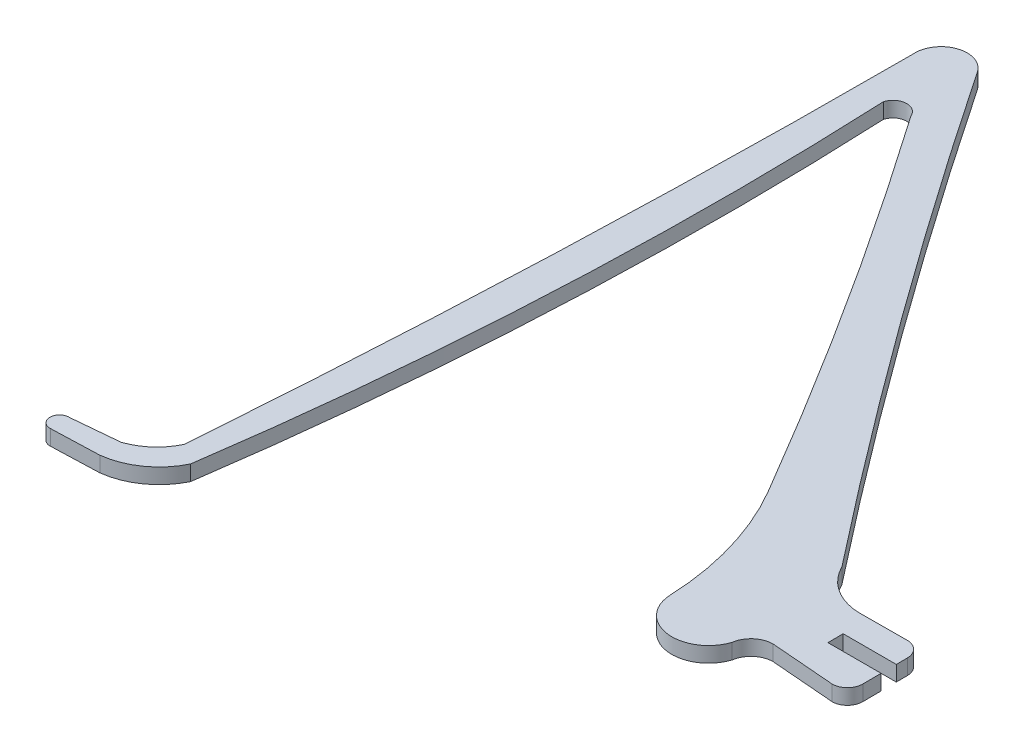
ISO-10303-21;
HEADER;
FILE_DESCRIPTION(('STEP AP214'),'2;1');
FILE_NAME('part.step','',(''),(''),'','','');
FILE_SCHEMA(('AUTOMOTIVE_DESIGN { 1 0 10303 214 1 1 1 1 }'));
ENDSEC;
DATA;
#1=APPLICATION_CONTEXT('core data for automotive mechanical design processes');
#2=APPLICATION_PROTOCOL_DEFINITION('international standard','automotive_design',2000,#1);
#3=PRODUCT_CONTEXT('',#1,'mechanical');
#4=PRODUCT('Part','Part','',(#3));
#5=PRODUCT_RELATED_PRODUCT_CATEGORY('part','',(#4));
#6=PRODUCT_DEFINITION_FORMATION('','',#4);
#7=PRODUCT_DEFINITION_CONTEXT('part definition',#1,'design');
#8=PRODUCT_DEFINITION('design','',#6,#7);
#9=PRODUCT_DEFINITION_SHAPE('','',#8);
#10=(LENGTH_UNIT() NAMED_UNIT(*) SI_UNIT(.MILLI.,.METRE.));
#11=(NAMED_UNIT(*) PLANE_ANGLE_UNIT() SI_UNIT($,.RADIAN.));
#12=(NAMED_UNIT(*) SI_UNIT($,.STERADIAN.) SOLID_ANGLE_UNIT());
#13=UNCERTAINTY_MEASURE_WITH_UNIT(LENGTH_MEASURE(1.E-05),#10,'distance_accuracy_value','');
#14=(GEOMETRIC_REPRESENTATION_CONTEXT(3) GLOBAL_UNCERTAINTY_ASSIGNED_CONTEXT((#13)) GLOBAL_UNIT_ASSIGNED_CONTEXT((#10,
#11,#12)) REPRESENTATION_CONTEXT('',''));
#15=CARTESIAN_POINT('',(0.,0.,0.));
#16=DIRECTION('',(0.,0.,1.));
#17=DIRECTION('',(1.,0.,0.));
#18=AXIS2_PLACEMENT_3D('',#15,#16,#17);
#19=CARTESIAN_POINT('',(-42152.2019871331,3.,-18324.132786319));
#20=DIRECTION('',(0.,-1.,0.));
#21=DIRECTION('',(0.,0.,-1.));
#22=AXIS2_PLACEMENT_3D('',#19,#20,#21);
#23=CYLINDRICAL_SURFACE('',#22,13.2933695187014);
#24=CARTESIAN_POINT('',(-42152.2019871331,0.,-18324.132786319));
#25=DIRECTION('',(0.,1.,0.));
#26=DIRECTION('',(0.,0.,1.));
#27=AXIS2_PLACEMENT_3D('',#24,#25,#26);
#28=CIRCLE('',#27,13.2933695187014);
#29=CARTESIAN_POINT('',(-42150.574219,0.,-18310.939453));
#30=VERTEX_POINT('',#29);
#31=CARTESIAN_POINT('',(-42140.243633,0.,-18318.326631));
#32=VERTEX_POINT('',#31);
#33=EDGE_CURVE('E227',#30,#32,#28,.T.);
#34=ORIENTED_EDGE('',*,*,#33,.T.);
#35=DIRECTION('',(0.,-1.,0.));
#36=VECTOR('',#35,1.);
#37=CARTESIAN_POINT('',(-42140.243633,3.,-18318.326631));
#38=LINE('',#37,#36);
#39=CARTESIAN_POINT('',(-42140.243633,3.,-18318.326631));
#40=VERTEX_POINT('',#39);
#41=EDGE_CURVE('E11',#40,#32,#38,.T.);
#42=ORIENTED_EDGE('',*,*,#41,.F.);
#43=CARTESIAN_POINT('',(-42152.2019871331,3.,-18324.132786319));
#44=DIRECTION('',(0.,1.,0.));
#45=DIRECTION('',(0.,0.,1.));
#46=AXIS2_PLACEMENT_3D('',#43,#44,#45);
#47=CIRCLE('',#46,13.2933695187014);
#48=CARTESIAN_POINT('',(-42150.574219,3.,-18310.939453));
#49=VERTEX_POINT('',#48);
#50=EDGE_CURVE('E273',#49,#40,#47,.T.);
#51=ORIENTED_EDGE('',*,*,#50,.F.);
#52=DIRECTION('',(0.,-1.,0.));
#53=VECTOR('',#52,1.);
#54=CARTESIAN_POINT('',(-42150.574219,3.,-18310.939453));
#55=LINE('',#54,#53);
#56=EDGE_CURVE('E223',#49,#30,#55,.T.);
#57=ORIENTED_EDGE('',*,*,#56,.T.);
#58=EDGE_LOOP('',(#34,#42,#51,#57));
#59=FACE_BOUND('',#58,.T.);
#60=ADVANCED_FACE('F35',(#59),#23,.T.);
#61=CARTESIAN_POINT('',(-42815.5416982019,3.,-18416.5647065553));
#62=DIRECTION('',(0.,-1.,0.));
#63=DIRECTION('',(0.,0.,-1.));
#64=AXIS2_PLACEMENT_3D('',#61,#62,#63);
#65=CYLINDRICAL_SURFACE('',#64,682.406181357024);
#66=CARTESIAN_POINT('',(-42815.5416982019,0.,-18416.5647065553));
#67=DIRECTION('',(0.,1.,0.));
#68=DIRECTION('',(0.,0.,1.));
#69=AXIS2_PLACEMENT_3D('',#66,#67,#68);
#70=CIRCLE('',#69,682.406181357024);
#71=CARTESIAN_POINT('',(-42133.839682,0.,-18447.557568));
#72=VERTEX_POINT('',#71);
#73=EDGE_CURVE('E230',#32,#72,#70,.T.);
#74=ORIENTED_EDGE('',*,*,#73,.T.);
#75=DIRECTION('',(0.,-1.,0.));
#76=VECTOR('',#75,1.);
#77=CARTESIAN_POINT('',(-42133.839682,3.,-18447.557568));
#78=LINE('',#77,#76);
#79=CARTESIAN_POINT('',(-42133.839682,3.,-18447.557568));
#80=VERTEX_POINT('',#79);
#81=EDGE_CURVE('E43',#80,#72,#78,.T.);
#82=ORIENTED_EDGE('',*,*,#81,.F.);
#83=CARTESIAN_POINT('',(-42815.5416982019,3.,-18416.5647065553));
#84=DIRECTION('',(0.,1.,0.));
#85=DIRECTION('',(0.,0.,1.));
#86=AXIS2_PLACEMENT_3D('',#83,#84,#85);
#87=CIRCLE('',#86,682.406181357024);
#88=EDGE_CURVE('E142',#40,#80,#87,.T.);
#89=ORIENTED_EDGE('',*,*,#88,.F.);
#90=ORIENTED_EDGE('',*,*,#41,.T.);
#91=EDGE_LOOP('',(#74,#82,#89,#90));
#92=FACE_BOUND('',#91,.T.);
#93=ADVANCED_FACE('F411',(#92),#65,.T.);
#94=CARTESIAN_POINT('',(-42131.2401209528,3.,-18446.8614757578));
#95=DIRECTION('',(0.,-1.,0.));
#96=DIRECTION('',(0.,0.,-1.));
#97=AXIS2_PLACEMENT_3D('',#94,#95,#96);
#98=CYLINDRICAL_SURFACE('',#97,2.69114511830755);
#99=CARTESIAN_POINT('',(-42131.2401209528,0.,-18446.8614757578));
#100=DIRECTION('',(0.,-1.,0.));
#101=DIRECTION('',(0.,0.,1.));
#102=AXIS2_PLACEMENT_3D('',#99,#100,#101);
#103=CIRCLE('',#102,2.69114511830755);
#104=CARTESIAN_POINT('',(-42128.7660750005,0.,-18447.9204180008));
#105=VERTEX_POINT('',#104);
#106=EDGE_CURVE('E232',#72,#105,#103,.T.);
#107=ORIENTED_EDGE('',*,*,#106,.T.);
#108=DIRECTION('',(0.,-1.,0.));
#109=VECTOR('',#108,1.);
#110=CARTESIAN_POINT('',(-42128.7660750005,3.,-18447.9204180008));
#111=LINE('',#110,#109);
#112=CARTESIAN_POINT('',(-42128.7660750005,3.,-18447.9204180008));
#113=VERTEX_POINT('',#112);
#114=EDGE_CURVE('E328',#113,#105,#111,.T.);
#115=ORIENTED_EDGE('',*,*,#114,.F.);
#116=CARTESIAN_POINT('',(-42131.2401209528,3.,-18446.8614757578));
#117=DIRECTION('',(0.,-1.,0.));
#118=DIRECTION('',(0.,0.,1.));
#119=AXIS2_PLACEMENT_3D('',#116,#117,#118);
#120=CIRCLE('',#119,2.69114511830755);
#121=EDGE_CURVE('E336',#80,#113,#120,.T.);
#122=ORIENTED_EDGE('',*,*,#121,.F.);
#123=ORIENTED_EDGE('',*,*,#81,.T.);
#124=EDGE_LOOP('',(#107,#115,#122,#123));
#125=FACE_BOUND('',#124,.T.);
#126=ADVANCED_FACE('F334',(#125),#98,.F.);
#127=CARTESIAN_POINT('',(-43061.4448435393,3.,-17796.1186435821));
#128=DIRECTION('',(0.,-1.,0.));
#129=DIRECTION('',(0.,0.,-1.));
#130=AXIS2_PLACEMENT_3D('',#127,#128,#129);
#131=CYLINDRICAL_SURFACE('',#130,1137.8643321672);
#132=CARTESIAN_POINT('',(-43061.4448435393,0.,-17796.1186435821));
#133=DIRECTION('',(0.,-1.,0.));
#134=DIRECTION('',(0.,0.,1.));
#135=AXIS2_PLACEMENT_3D('',#132,#133,#134);
#136=CIRCLE('',#135,1137.8643321672);
#137=CARTESIAN_POINT('',(-42079.0087570001,0.,-18370.187084));
#138=VERTEX_POINT('',#137);
#139=EDGE_CURVE('E234',#105,#138,#136,.T.);
#140=ORIENTED_EDGE('',*,*,#139,.T.);
#141=DIRECTION('',(0.,-1.,0.));
#142=VECTOR('',#141,1.);
#143=CARTESIAN_POINT('',(-42079.0087570001,3.,-18370.187084));
#144=LINE('',#143,#142);
#145=CARTESIAN_POINT('',(-42079.0087570001,3.,-18370.187084));
#146=VERTEX_POINT('',#145);
#147=EDGE_CURVE('E325',#146,#138,#144,.T.);
#148=ORIENTED_EDGE('',*,*,#147,.F.);
#149=CARTESIAN_POINT('',(-43061.4448435393,3.,-17796.1186435821));
#150=DIRECTION('',(0.,-1.,0.));
#151=DIRECTION('',(0.,0.,1.));
#152=AXIS2_PLACEMENT_3D('',#149,#150,#151);
#153=CIRCLE('',#152,1137.8643321672);
#154=EDGE_CURVE('E354',#113,#146,#153,.T.);
#155=ORIENTED_EDGE('',*,*,#154,.F.);
#156=ORIENTED_EDGE('',*,*,#114,.T.);
#157=EDGE_LOOP('',(#140,#148,#155,#156));
#158=FACE_BOUND('',#157,.T.);
#159=ADVANCED_FACE('F345',(#158),#131,.F.);
#160=CARTESIAN_POINT('',(-42129.6551655374,3.,-18340.5861490765));
#161=DIRECTION('',(0.,-1.,0.));
#162=DIRECTION('',(0.,0.,-1.));
#163=AXIS2_PLACEMENT_3D('',#160,#161,#162);
#164=CYLINDRICAL_SURFACE('',#163,58.6623733417004);
#165=CARTESIAN_POINT('',(-42129.6551655374,0.,-18340.5861490765));
#166=DIRECTION('',(0.,-1.,0.));
#167=DIRECTION('',(0.,0.,1.));
#168=AXIS2_PLACEMENT_3D('',#165,#166,#167);
#169=CIRCLE('',#168,58.6623733417004);
#170=CARTESIAN_POINT('',(-42071.044649,0.,-18343.052198));
#171=VERTEX_POINT('',#170);
#172=EDGE_CURVE('E236',#138,#171,#169,.T.);
#173=ORIENTED_EDGE('',*,*,#172,.T.);
#174=DIRECTION('',(0.,-1.,0.));
#175=VECTOR('',#174,1.);
#176=CARTESIAN_POINT('',(-42071.044649,3.,-18343.052198));
#177=LINE('',#176,#175);
#178=CARTESIAN_POINT('',(-42071.044649,3.,-18343.052198));
#179=VERTEX_POINT('',#178);
#180=EDGE_CURVE('E322',#179,#171,#177,.T.);
#181=ORIENTED_EDGE('',*,*,#180,.F.);
#182=CARTESIAN_POINT('',(-42129.6551655374,3.,-18340.5861490765));
#183=DIRECTION('',(0.,-1.,0.));
#184=DIRECTION('',(0.,0.,1.));
#185=AXIS2_PLACEMENT_3D('',#182,#183,#184);
#186=CIRCLE('',#185,58.6623733417004);
#187=EDGE_CURVE('E351',#146,#179,#186,.T.);
#188=ORIENTED_EDGE('',*,*,#187,.F.);
#189=ORIENTED_EDGE('',*,*,#147,.T.);
#190=EDGE_LOOP('',(#173,#181,#188,#189));
#191=FACE_BOUND('',#190,.T.);
#192=ADVANCED_FACE('F349',(#191),#164,.F.);
#193=CARTESIAN_POINT('',(-42063.8327879743,3.,-18343.3555760008));
#194=DIRECTION('',(0.,-1.,0.));
#195=DIRECTION('',(0.,0.,-1.));
#196=AXIS2_PLACEMENT_3D('',#193,#194,#195);
#197=CYLINDRICAL_SURFACE('',#196,7.21823923584698);
#198=CARTESIAN_POINT('',(-42063.8327879743,0.,-18343.3555760008));
#199=DIRECTION('',(0.,1.,0.));
#200=DIRECTION('',(0.,0.,1.));
#201=AXIS2_PLACEMENT_3D('',#198,#199,#200);
#202=CIRCLE('',#201,7.21823923584698);
#203=CARTESIAN_POINT('',(-42056.987565,0.,-18341.0651829999));
#204=VERTEX_POINT('',#203);
#205=EDGE_CURVE('E238',#171,#204,#202,.T.);
#206=ORIENTED_EDGE('',*,*,#205,.T.);
#207=DIRECTION('',(0.,-1.,0.));
#208=VECTOR('',#207,1.);
#209=CARTESIAN_POINT('',(-42056.987565,3.,-18341.0651829999));
#210=LINE('',#209,#208);
#211=CARTESIAN_POINT('',(-42056.987565,3.,-18341.0651829999));
#212=VERTEX_POINT('',#211);
#213=EDGE_CURVE('E319',#212,#204,#210,.T.);
#214=ORIENTED_EDGE('',*,*,#213,.F.);
#215=CARTESIAN_POINT('',(-42063.8327879743,3.,-18343.3555760008));
#216=DIRECTION('',(0.,1.,0.));
#217=DIRECTION('',(0.,0.,1.));
#218=AXIS2_PLACEMENT_3D('',#215,#216,#217);
#219=CIRCLE('',#218,7.21823923584698);
#220=EDGE_CURVE('E353',#179,#212,#219,.T.);
#221=ORIENTED_EDGE('',*,*,#220,.F.);
#222=ORIENTED_EDGE('',*,*,#180,.T.);
#223=EDGE_LOOP('',(#206,#214,#221,#222));
#224=FACE_BOUND('',#223,.T.);
#225=ADVANCED_FACE('F424',(#224),#197,.T.);
#226=CARTESIAN_POINT('',(-42052.671817147,3.,-18340.478566385));
#227=DIRECTION('',(0.,-1.,0.));
#228=DIRECTION('',(0.,0.,-1.));
#229=AXIS2_PLACEMENT_3D('',#226,#227,#228);
#230=CYLINDRICAL_SURFACE('',#229,4.35543322569655);
#231=CARTESIAN_POINT('',(-42052.671817147,0.,-18340.478566385));
#232=DIRECTION('',(0.,-1.,0.));
#233=DIRECTION('',(0.,0.,1.));
#234=AXIS2_PLACEMENT_3D('',#231,#232,#233);
#235=CIRCLE('',#234,4.35543322569655);
#236=CARTESIAN_POINT('',(-42052.660156,0.,-18344.833984));
#237=VERTEX_POINT('',#236);
#238=EDGE_CURVE('E240',#204,#237,#235,.T.);
#239=ORIENTED_EDGE('',*,*,#238,.T.);
#240=DIRECTION('',(0.,-1.,0.));
#241=VECTOR('',#240,1.);
#242=CARTESIAN_POINT('',(-42052.660156,3.,-18344.833984));
#243=LINE('',#242,#241);
#244=CARTESIAN_POINT('',(-42052.660156,3.,-18344.833984));
#245=VERTEX_POINT('',#244);
#246=EDGE_CURVE('E316',#245,#237,#243,.T.);
#247=ORIENTED_EDGE('',*,*,#246,.F.);
#248=CARTESIAN_POINT('',(-42052.671817147,3.,-18340.478566385));
#249=DIRECTION('',(0.,-1.,0.));
#250=DIRECTION('',(0.,0.,1.));
#251=AXIS2_PLACEMENT_3D('',#248,#249,#250);
#252=CIRCLE('',#251,4.35543322569655);
#253=EDGE_CURVE('E356',#212,#245,#252,.T.);
#254=ORIENTED_EDGE('',*,*,#253,.F.);
#255=ORIENTED_EDGE('',*,*,#213,.T.);
#256=EDGE_LOOP('',(#239,#247,#254,#255));
#257=FACE_BOUND('',#256,.T.);
#258=ADVANCED_FACE('F427',(#257),#230,.F.);
#259=CARTESIAN_POINT('',(-42040.093369,3.,-18343.8164720001));
#260=DIRECTION('',(0.0807042381147705,0.,-0.996738092956376));
#261=DIRECTION('',(-0.996738092956377,0.,-0.0807042381147705));
#262=AXIS2_PLACEMENT_3D('',#259,#260,#261);
#263=PLANE('',#262);
#264=DIRECTION('',(0.996738092956377,0.,0.0807042381147705));
#265=VECTOR('',#264,1.);
#266=CARTESIAN_POINT('',(-42040.093369,0.,-18343.8164720001));
#267=LINE('',#266,#265);
#268=CARTESIAN_POINT('',(-42040.093369,0.,-18343.8164720001));
#269=VERTEX_POINT('',#268);
#270=EDGE_CURVE('E242',#237,#269,#267,.T.);
#271=ORIENTED_EDGE('',*,*,#270,.T.);
#272=DIRECTION('',(0.,-1.,0.));
#273=VECTOR('',#272,1.);
#274=CARTESIAN_POINT('',(-42040.093369,3.,-18343.8164720001));
#275=LINE('',#274,#273);
#276=CARTESIAN_POINT('',(-42040.093369,3.,-18343.8164720001));
#277=VERTEX_POINT('',#276);
#278=EDGE_CURVE('E313',#277,#269,#275,.T.);
#279=ORIENTED_EDGE('',*,*,#278,.F.);
#280=DIRECTION('',(0.996738092956377,0.,0.0807042381147705));
#281=VECTOR('',#280,1.);
#282=CARTESIAN_POINT('',(-42040.093369,3.,-18343.8164720001));
#283=LINE('',#282,#281);
#284=EDGE_CURVE('E362',#245,#277,#283,.T.);
#285=ORIENTED_EDGE('',*,*,#284,.F.);
#286=ORIENTED_EDGE('',*,*,#246,.T.);
#287=EDGE_LOOP('',(#271,#279,#285,#286));
#288=FACE_BOUND('',#287,.T.);
#289=ADVANCED_FACE('F431',(#288),#263,.F.);
#290=CARTESIAN_POINT('',(-42040.1151884056,3.,-18346.8144708554));
#291=DIRECTION('',(0.,-1.,0.));
#292=DIRECTION('',(0.,0.,-1.));
#293=AXIS2_PLACEMENT_3D('',#290,#291,#292);
#294=CYLINDRICAL_SURFACE('',#293,2.99807825499825);
#295=CARTESIAN_POINT('',(-42040.1151884056,0.,-18346.8144708554));
#296=DIRECTION('',(0.,1.,0.));
#297=DIRECTION('',(0.,0.,1.));
#298=AXIS2_PLACEMENT_3D('',#295,#296,#297);
#299=CIRCLE('',#298,2.99807825499825);
#300=CARTESIAN_POINT('',(-42037.117187,0.,-18346.835937));
#301=VERTEX_POINT('',#300);
#302=EDGE_CURVE('E244',#269,#301,#299,.T.);
#303=ORIENTED_EDGE('',*,*,#302,.T.);
#304=DIRECTION('',(0.,-1.,0.));
#305=VECTOR('',#304,1.);
#306=CARTESIAN_POINT('',(-42037.117187,3.,-18346.835937));
#307=LINE('',#306,#305);
#308=CARTESIAN_POINT('',(-42037.117187,3.,-18346.835937));
#309=VERTEX_POINT('',#308);
#310=EDGE_CURVE('E310',#309,#301,#307,.T.);
#311=ORIENTED_EDGE('',*,*,#310,.F.);
#312=CARTESIAN_POINT('',(-42040.1151884056,3.,-18346.8144708554));
#313=DIRECTION('',(0.,1.,0.));
#314=DIRECTION('',(0.,0.,1.));
#315=AXIS2_PLACEMENT_3D('',#312,#313,#314);
#316=CIRCLE('',#315,2.99807825499825);
#317=EDGE_CURVE('E364',#277,#309,#316,.T.);
#318=ORIENTED_EDGE('',*,*,#317,.F.);
#319=ORIENTED_EDGE('',*,*,#278,.T.);
#320=EDGE_LOOP('',(#303,#311,#318,#319));
#321=FACE_BOUND('',#320,.T.);
#322=ADVANCED_FACE('F435',(#321),#294,.T.);
#323=CARTESIAN_POINT('',(-42037.140625,3.,-18350.431641));
#324=DIRECTION('',(-0.999978756337311,0.,0.00651819561568033));
#325=DIRECTION('',(0.00651819561568033,0.,0.999978756337311));
#326=AXIS2_PLACEMENT_3D('',#323,#324,#325);
#327=PLANE('',#326);
#328=DIRECTION('',(-0.00651819561568033,0.,-0.999978756337311));
#329=VECTOR('',#328,1.);
#330=CARTESIAN_POINT('',(-42037.140625,0.,-18350.431641));
#331=LINE('',#330,#329);
#332=CARTESIAN_POINT('',(-42037.140625,0.,-18350.431641));
#333=VERTEX_POINT('',#332);
#334=EDGE_CURVE('E246',#301,#333,#331,.T.);
#335=ORIENTED_EDGE('',*,*,#334,.T.);
#336=DIRECTION('',(0.,-1.,0.));
#337=VECTOR('',#336,1.);
#338=CARTESIAN_POINT('',(-42037.140625,3.,-18350.431641));
#339=LINE('',#338,#337);
#340=CARTESIAN_POINT('',(-42037.140625,3.,-18350.431641));
#341=VERTEX_POINT('',#340);
#342=EDGE_CURVE('E307',#341,#333,#339,.T.);
#343=ORIENTED_EDGE('',*,*,#342,.F.);
#344=DIRECTION('',(-0.00651819561568033,0.,-0.999978756337311));
#345=VECTOR('',#344,1.);
#346=CARTESIAN_POINT('',(-42037.140625,3.,-18350.431641));
#347=LINE('',#346,#345);
#348=EDGE_CURVE('E366',#309,#341,#347,.T.);
#349=ORIENTED_EDGE('',*,*,#348,.F.);
#350=ORIENTED_EDGE('',*,*,#310,.T.);
#351=EDGE_LOOP('',(#335,#343,#349,#350));
#352=FACE_BOUND('',#351,.T.);
#353=ADVANCED_FACE('F439',(#352),#327,.F.);
#354=CARTESIAN_POINT('',(-42047.542969,3.,-18350.429687));
#355=DIRECTION('',(0.000187842275142555,0.,0.99999998235764));
#356=DIRECTION('',(0.99999998235764,0.,-0.000187842275142555));
#357=AXIS2_PLACEMENT_3D('',#354,#355,#356);
#358=PLANE('',#357);
#359=DIRECTION('',(-0.99999998235764,0.,0.000187842275142555));
#360=VECTOR('',#359,1.);
#361=CARTESIAN_POINT('',(-42047.542969,0.,-18350.429687));
#362=LINE('',#361,#360);
#363=CARTESIAN_POINT('',(-42047.542969,0.,-18350.429687));
#364=VERTEX_POINT('',#363);
#365=EDGE_CURVE('E248',#333,#364,#362,.T.);
#366=ORIENTED_EDGE('',*,*,#365,.T.);
#367=DIRECTION('',(0.,-1.,0.));
#368=VECTOR('',#367,1.);
#369=CARTESIAN_POINT('',(-42047.542969,3.,-18350.429687));
#370=LINE('',#369,#368);
#371=CARTESIAN_POINT('',(-42047.542969,3.,-18350.429687));
#372=VERTEX_POINT('',#371);
#373=EDGE_CURVE('E304',#372,#364,#370,.T.);
#374=ORIENTED_EDGE('',*,*,#373,.F.);
#375=DIRECTION('',(-0.99999998235764,0.,0.000187842275142555));
#376=VECTOR('',#375,1.);
#377=CARTESIAN_POINT('',(-42047.542969,3.,-18350.429687));
#378=LINE('',#377,#376);
#379=EDGE_CURVE('E368',#341,#372,#378,.T.);
#380=ORIENTED_EDGE('',*,*,#379,.F.);
#381=ORIENTED_EDGE('',*,*,#342,.T.);
#382=EDGE_LOOP('',(#366,#374,#380,#381));
#383=FACE_BOUND('',#382,.T.);
#384=ADVANCED_FACE('F443',(#383),#358,.F.);
#385=CARTESIAN_POINT('',(-42047.566406,3.,-18353.429687));
#386=DIRECTION('',(-0.999969485120749,0.,0.00781209493955122));
#387=DIRECTION('',(0.00781209493955122,0.,0.999969485120749));
#388=AXIS2_PLACEMENT_3D('',#385,#386,#387);
#389=PLANE('',#388);
#390=DIRECTION('',(-0.00781209493955123,0.,-0.999969485120749));
#391=VECTOR('',#390,1.);
#392=CARTESIAN_POINT('',(-42047.566406,0.,-18353.429687));
#393=LINE('',#392,#391);
#394=CARTESIAN_POINT('',(-42047.566406,0.,-18353.429687));
#395=VERTEX_POINT('',#394);
#396=EDGE_CURVE('E250',#364,#395,#393,.T.);
#397=ORIENTED_EDGE('',*,*,#396,.T.);
#398=DIRECTION('',(0.,-1.,0.));
#399=VECTOR('',#398,1.);
#400=CARTESIAN_POINT('',(-42047.566406,3.,-18353.429687));
#401=LINE('',#400,#399);
#402=CARTESIAN_POINT('',(-42047.566406,3.,-18353.429687));
#403=VERTEX_POINT('',#402);
#404=EDGE_CURVE('E301',#403,#395,#401,.T.);
#405=ORIENTED_EDGE('',*,*,#404,.F.);
#406=DIRECTION('',(-0.00781209493955123,0.,-0.999969485120749));
#407=VECTOR('',#406,1.);
#408=CARTESIAN_POINT('',(-42047.566406,3.,-18353.429687));
#409=LINE('',#408,#407);
#410=EDGE_CURVE('E370',#372,#403,#409,.T.);
#411=ORIENTED_EDGE('',*,*,#410,.F.);
#412=ORIENTED_EDGE('',*,*,#373,.T.);
#413=EDGE_LOOP('',(#397,#405,#411,#412));
#414=FACE_BOUND('',#413,.T.);
#415=ADVANCED_FACE('F447',(#414),#389,.F.);
#416=CARTESIAN_POINT('',(-42037.160156,3.,-18353.429687));
#417=DIRECTION('',(0.,0.,-1.));
#418=DIRECTION('',(-1.,0.,0.));
#419=AXIS2_PLACEMENT_3D('',#416,#417,#418);
#420=PLANE('',#419);
#421=DIRECTION('',(1.,0.,0.));
#422=VECTOR('',#421,1.);
#423=CARTESIAN_POINT('',(-42037.160156,0.,-18353.429687));
#424=LINE('',#423,#422);
#425=CARTESIAN_POINT('',(-42037.160156,0.,-18353.429687));
#426=VERTEX_POINT('',#425);
#427=EDGE_CURVE('E252',#395,#426,#424,.T.);
#428=ORIENTED_EDGE('',*,*,#427,.T.);
#429=DIRECTION('',(0.,-1.,0.));
#430=VECTOR('',#429,1.);
#431=CARTESIAN_POINT('',(-42037.160156,3.,-18353.429687));
#432=LINE('',#431,#430);
#433=CARTESIAN_POINT('',(-42037.160156,3.,-18353.429687));
#434=VERTEX_POINT('',#433);
#435=EDGE_CURVE('E298',#434,#426,#432,.T.);
#436=ORIENTED_EDGE('',*,*,#435,.F.);
#437=DIRECTION('',(1.,0.,0.));
#438=VECTOR('',#437,1.);
#439=CARTESIAN_POINT('',(-42037.160156,3.,-18353.429687));
#440=LINE('',#439,#438);
#441=EDGE_CURVE('E372',#403,#434,#440,.T.);
#442=ORIENTED_EDGE('',*,*,#441,.F.);
#443=ORIENTED_EDGE('',*,*,#404,.T.);
#444=EDGE_LOOP('',(#428,#436,#442,#443));
#445=FACE_BOUND('',#444,.T.);
#446=ADVANCED_FACE('F451',(#445),#420,.F.);
#447=CARTESIAN_POINT('',(-42037.171934,3.,-18355.612608));
#448=DIRECTION('',(-0.999985444484614,0.,0.00539544427346079));
#449=DIRECTION('',(0.00539544427346079,0.,0.999985444484615));
#450=AXIS2_PLACEMENT_3D('',#447,#448,#449);
#451=PLANE('',#450);
#452=DIRECTION('',(-0.00539544427346079,0.,-0.999985444484615));
#453=VECTOR('',#452,1.);
#454=CARTESIAN_POINT('',(-42037.171934,0.,-18355.612608));
#455=LINE('',#454,#453);
#456=CARTESIAN_POINT('',(-42037.171934,0.,-18355.612608));
#457=VERTEX_POINT('',#456);
#458=EDGE_CURVE('E254',#426,#457,#455,.T.);
#459=ORIENTED_EDGE('',*,*,#458,.T.);
#460=DIRECTION('',(0.,-1.,0.));
#461=VECTOR('',#460,1.);
#462=CARTESIAN_POINT('',(-42037.171934,3.,-18355.612608));
#463=LINE('',#462,#461);
#464=CARTESIAN_POINT('',(-42037.171934,3.,-18355.612608));
#465=VERTEX_POINT('',#464);
#466=EDGE_CURVE('E295',#465,#457,#463,.T.);
#467=ORIENTED_EDGE('',*,*,#466,.F.);
#468=DIRECTION('',(-0.00539544427346079,0.,-0.999985444484615));
#469=VECTOR('',#468,1.);
#470=CARTESIAN_POINT('',(-42037.171934,3.,-18355.612608));
#471=LINE('',#470,#469);
#472=EDGE_CURVE('E374',#434,#465,#471,.T.);
#473=ORIENTED_EDGE('',*,*,#472,.F.);
#474=ORIENTED_EDGE('',*,*,#435,.T.);
#475=EDGE_LOOP('',(#459,#467,#473,#474));
#476=FACE_BOUND('',#475,.T.);
#477=ADVANCED_FACE('F455',(#476),#451,.F.);
#478=CARTESIAN_POINT('',(-42040.1738707403,3.,-18355.5957229876));
#479=DIRECTION('',(0.,-1.,0.));
#480=DIRECTION('',(0.,0.,-1.));
#481=AXIS2_PLACEMENT_3D('',#478,#479,#480);
#482=CYLINDRICAL_SURFACE('',#481,3.00198422650736);
#483=CARTESIAN_POINT('',(-42040.1738707403,0.,-18355.5957229876));
#484=DIRECTION('',(0.,1.,0.));
#485=DIRECTION('',(0.,0.,1.));
#486=AXIS2_PLACEMENT_3D('',#483,#484,#485);
#487=CIRCLE('',#486,3.00198422650736);
#488=CARTESIAN_POINT('',(-42040.191406,0.,-18358.597656));
#489=VERTEX_POINT('',#488);
#490=EDGE_CURVE('E256',#457,#489,#487,.T.);
#491=ORIENTED_EDGE('',*,*,#490,.T.);
#492=DIRECTION('',(0.,-1.,0.));
#493=VECTOR('',#492,1.);
#494=CARTESIAN_POINT('',(-42040.191406,3.,-18358.597656));
#495=LINE('',#494,#493);
#496=CARTESIAN_POINT('',(-42040.191406,3.,-18358.597656));
#497=VERTEX_POINT('',#496);
#498=EDGE_CURVE('E292',#497,#489,#495,.T.);
#499=ORIENTED_EDGE('',*,*,#498,.F.);
#500=CARTESIAN_POINT('',(-42040.1738707403,3.,-18355.5957229876));
#501=DIRECTION('',(0.,1.,0.));
#502=DIRECTION('',(0.,0.,1.));
#503=AXIS2_PLACEMENT_3D('',#500,#501,#502);
#504=CIRCLE('',#503,3.00198422650736);
#505=EDGE_CURVE('E376',#465,#497,#504,.T.);
#506=ORIENTED_EDGE('',*,*,#505,.F.);
#507=ORIENTED_EDGE('',*,*,#466,.T.);
#508=EDGE_LOOP('',(#491,#499,#506,#507));
#509=FACE_BOUND('',#508,.T.);
#510=ADVANCED_FACE('F459',(#509),#482,.T.);
#511=CARTESIAN_POINT('',(-42049.491433,3.,-18358.539661));
#512=DIRECTION('',(0.00623588214881379,0.,0.999980556697892));
#513=DIRECTION('',(0.999980556697892,0.,-0.00623588214881379));
#514=AXIS2_PLACEMENT_3D('',#511,#512,#513);
#515=PLANE('',#514);
#516=DIRECTION('',(-0.999980556697892,0.,0.00623588214881379));
#517=VECTOR('',#516,1.);
#518=CARTESIAN_POINT('',(-42049.491433,0.,-18358.539661));
#519=LINE('',#518,#517);
#520=CARTESIAN_POINT('',(-42049.491433,0.,-18358.539661));
#521=VERTEX_POINT('',#520);
#522=EDGE_CURVE('E258',#489,#521,#519,.T.);
#523=ORIENTED_EDGE('',*,*,#522,.T.);
#524=DIRECTION('',(0.,-1.,0.));
#525=VECTOR('',#524,1.);
#526=CARTESIAN_POINT('',(-42049.491433,3.,-18358.539661));
#527=LINE('',#526,#525);
#528=CARTESIAN_POINT('',(-42049.491433,3.,-18358.539661));
#529=VERTEX_POINT('',#528);
#530=EDGE_CURVE('E289',#529,#521,#527,.T.);
#531=ORIENTED_EDGE('',*,*,#530,.F.);
#532=DIRECTION('',(-0.999980556697892,0.,0.00623588214881379));
#533=VECTOR('',#532,1.);
#534=CARTESIAN_POINT('',(-42049.491433,3.,-18358.539661));
#535=LINE('',#534,#533);
#536=EDGE_CURVE('E378',#497,#529,#535,.T.);
#537=ORIENTED_EDGE('',*,*,#536,.F.);
#538=ORIENTED_EDGE('',*,*,#498,.T.);
#539=EDGE_LOOP('',(#523,#531,#537,#538));
#540=FACE_BOUND('',#539,.T.);
#541=ADVANCED_FACE('F463',(#540),#515,.F.);
#542=CARTESIAN_POINT('',(-42049.2636222941,3.,-18369.3937970783));
#543=DIRECTION('',(0.,-1.,0.));
#544=DIRECTION('',(0.,0.,-1.));
#545=AXIS2_PLACEMENT_3D('',#542,#543,#544);
#546=CYLINDRICAL_SURFACE('',#545,10.8565265035998);
#547=CARTESIAN_POINT('',(-42049.2636222941,0.,-18369.3937970783));
#548=DIRECTION('',(0.,-1.,0.));
#549=DIRECTION('',(0.,0.,1.));
#550=AXIS2_PLACEMENT_3D('',#547,#548,#549);
#551=CIRCLE('',#550,10.8565265035998);
#552=CARTESIAN_POINT('',(-42059.0278360001,0.,-18364.6478200001));
#553=VERTEX_POINT('',#552);
#554=EDGE_CURVE('E260',#521,#553,#551,.T.);
#555=ORIENTED_EDGE('',*,*,#554,.T.);
#556=DIRECTION('',(0.,-1.,0.));
#557=VECTOR('',#556,1.);
#558=CARTESIAN_POINT('',(-42059.0278360001,3.,-18364.6478200001));
#559=LINE('',#558,#557);
#560=CARTESIAN_POINT('',(-42059.0278360001,3.,-18364.6478200001));
#561=VERTEX_POINT('',#560);
#562=EDGE_CURVE('E286',#561,#553,#559,.T.);
#563=ORIENTED_EDGE('',*,*,#562,.F.);
#564=CARTESIAN_POINT('',(-42049.2636222941,3.,-18369.3937970783));
#565=DIRECTION('',(0.,-1.,0.));
#566=DIRECTION('',(0.,0.,1.));
#567=AXIS2_PLACEMENT_3D('',#564,#565,#566);
#568=CIRCLE('',#567,10.8565265035998);
#569=EDGE_CURVE('E380',#529,#561,#568,.T.);
#570=ORIENTED_EDGE('',*,*,#569,.F.);
#571=ORIENTED_EDGE('',*,*,#530,.T.);
#572=EDGE_LOOP('',(#555,#563,#570,#571));
#573=FACE_BOUND('',#572,.T.);
#574=ADVANCED_FACE('F467',(#573),#546,.F.);
#575=CARTESIAN_POINT('',(-40797.9447473599,3.,-19355.7711935999));
#576=DIRECTION('',(0.,-1.,0.));
#577=DIRECTION('',(0.,0.,-1.));
#578=AXIS2_PLACEMENT_3D('',#575,#576,#577);
#579=CYLINDRICAL_SURFACE('',#578,1603.9501545092);
#580=CARTESIAN_POINT('',(-40797.9447473599,0.,-19355.7711935999));
#581=DIRECTION('',(0.,-1.,0.));
#582=DIRECTION('',(0.,0.,1.));
#583=AXIS2_PLACEMENT_3D('',#580,#581,#582);
#584=CIRCLE('',#583,1603.9501545092);
#585=CARTESIAN_POINT('',(-42129.663375,0.,-18461.801622));
#586=VERTEX_POINT('',#585);
#587=EDGE_CURVE('E262',#553,#586,#584,.T.);
#588=ORIENTED_EDGE('',*,*,#587,.T.);
#589=DIRECTION('',(0.,-1.,0.));
#590=VECTOR('',#589,1.);
#591=CARTESIAN_POINT('',(-42129.663375,3.,-18461.801622));
#592=LINE('',#591,#590);
#593=CARTESIAN_POINT('',(-42129.663375,3.,-18461.801622));
#594=VERTEX_POINT('',#593);
#595=EDGE_CURVE('E283',#594,#586,#592,.T.);
#596=ORIENTED_EDGE('',*,*,#595,.F.);
#597=CARTESIAN_POINT('',(-40797.9447473599,3.,-19355.7711935999));
#598=DIRECTION('',(0.,-1.,0.));
#599=DIRECTION('',(0.,0.,1.));
#600=AXIS2_PLACEMENT_3D('',#597,#598,#599);
#601=CIRCLE('',#600,1603.9501545092);
#602=EDGE_CURVE('E382',#561,#594,#601,.T.);
#603=ORIENTED_EDGE('',*,*,#602,.F.);
#604=ORIENTED_EDGE('',*,*,#562,.T.);
#605=EDGE_LOOP('',(#588,#596,#603,#604));
#606=FACE_BOUND('',#605,.T.);
#607=ADVANCED_FACE('F471',(#606),#579,.F.);
#608=CARTESIAN_POINT('',(-42133.9151477873,3.,-18458.9488362226));
#609=DIRECTION('',(0.,-1.,0.));
#610=DIRECTION('',(0.,0.,-1.));
#611=AXIS2_PLACEMENT_3D('',#608,#609,#610);
#612=CYLINDRICAL_SURFACE('',#611,5.12015219756575);
#613=CARTESIAN_POINT('',(-42133.9151477873,0.,-18458.9488362226));
#614=DIRECTION('',(0.,1.,0.));
#615=DIRECTION('',(0.,0.,1.));
#616=AXIS2_PLACEMENT_3D('',#613,#614,#615);
#617=CIRCLE('',#616,5.12015219756575);
#618=CARTESIAN_POINT('',(-42139.015984,0.,-18458.5045070013));
#619=VERTEX_POINT('',#618);
#620=EDGE_CURVE('E264',#586,#619,#617,.T.);
#621=ORIENTED_EDGE('',*,*,#620,.T.);
#622=DIRECTION('',(0.,-1.,0.));
#623=VECTOR('',#622,1.);
#624=CARTESIAN_POINT('',(-42139.015984,3.,-18458.5045070013));
#625=LINE('',#624,#623);
#626=CARTESIAN_POINT('',(-42139.015984,3.,-18458.5045070013));
#627=VERTEX_POINT('',#626);
#628=EDGE_CURVE('E280',#627,#619,#625,.T.);
#629=ORIENTED_EDGE('',*,*,#628,.F.);
#630=CARTESIAN_POINT('',(-42133.9151477873,3.,-18458.9488362226));
#631=DIRECTION('',(0.,1.,0.));
#632=DIRECTION('',(0.,0.,1.));
#633=AXIS2_PLACEMENT_3D('',#630,#631,#632);
#634=CIRCLE('',#633,5.12015219756575);
#635=EDGE_CURVE('E384',#594,#627,#634,.T.);
#636=ORIENTED_EDGE('',*,*,#635,.F.);
#637=ORIENTED_EDGE('',*,*,#595,.T.);
#638=EDGE_LOOP('',(#621,#629,#636,#637));
#639=FACE_BOUND('',#638,.T.);
#640=ADVANCED_FACE('F475',(#639),#612,.T.);
#641=CARTESIAN_POINT('',(-43909.458271375,3.,-18456.1994123119));
#642=DIRECTION('',(0.,-1.,0.));
#643=DIRECTION('',(0.,0.,-1.));
#644=AXIS2_PLACEMENT_3D('',#641,#642,#643);
#645=CYLINDRICAL_SURFACE('',#644,1770.4437879772);
#646=CARTESIAN_POINT('',(-43909.458271375,0.,-18456.1994123119));
#647=DIRECTION('',(0.,-1.,0.));
#648=DIRECTION('',(0.,0.,1.));
#649=AXIS2_PLACEMENT_3D('',#646,#647,#648);
#650=CIRCLE('',#649,1770.4437879772);
#651=CARTESIAN_POINT('',(-42144.18154,0.,-18321.035556));
#652=VERTEX_POINT('',#651);
#653=EDGE_CURVE('E266',#619,#652,#650,.T.);
#654=ORIENTED_EDGE('',*,*,#653,.T.);
#655=DIRECTION('',(0.,-1.,0.));
#656=VECTOR('',#655,1.);
#657=CARTESIAN_POINT('',(-42144.18154,3.,-18321.035556));
#658=LINE('',#657,#656);
#659=CARTESIAN_POINT('',(-42144.18154,3.,-18321.035556));
#660=VERTEX_POINT('',#659);
#661=EDGE_CURVE('E277',#660,#652,#658,.T.);
#662=ORIENTED_EDGE('',*,*,#661,.F.);
#663=CARTESIAN_POINT('',(-43909.458271375,3.,-18456.1994123119));
#664=DIRECTION('',(0.,-1.,0.));
#665=DIRECTION('',(0.,0.,1.));
#666=AXIS2_PLACEMENT_3D('',#663,#664,#665);
#667=CIRCLE('',#666,1770.4437879772);
#668=EDGE_CURVE('E386',#627,#660,#667,.T.);
#669=ORIENTED_EDGE('',*,*,#668,.F.);
#670=ORIENTED_EDGE('',*,*,#628,.T.);
#671=EDGE_LOOP('',(#654,#662,#669,#670));
#672=FACE_BOUND('',#671,.T.);
#673=ADVANCED_FACE('F392',(#672),#645,.F.);
#674=CARTESIAN_POINT('',(-42154.3243413813,3.,-18325.8421180657));
#675=DIRECTION('',(0.,-1.,0.));
#676=DIRECTION('',(0.,0.,-1.));
#677=AXIS2_PLACEMENT_3D('',#674,#675,#676);
#678=CYLINDRICAL_SURFACE('',#677,11.2240571431012);
#679=CARTESIAN_POINT('',(-42154.3243413813,0.,-18325.8421180657));
#680=DIRECTION('',(0.,-1.,0.));
#681=DIRECTION('',(0.,0.,1.));
#682=AXIS2_PLACEMENT_3D('',#679,#680,#681);
#683=CIRCLE('',#682,11.2240571431012);
#684=CARTESIAN_POINT('',(-42150.730469,0.,-18315.208984));
#685=VERTEX_POINT('',#684);
#686=EDGE_CURVE('E268',#652,#685,#683,.T.);
#687=ORIENTED_EDGE('',*,*,#686,.T.);
#688=DIRECTION('',(0.,-1.,0.));
#689=VECTOR('',#688,1.);
#690=CARTESIAN_POINT('',(-42150.730469,3.,-18315.208984));
#691=LINE('',#690,#689);
#692=CARTESIAN_POINT('',(-42150.730469,3.,-18315.208984));
#693=VERTEX_POINT('',#692);
#694=EDGE_CURVE('E218',#693,#685,#691,.T.);
#695=ORIENTED_EDGE('',*,*,#694,.F.);
#696=CARTESIAN_POINT('',(-42154.3243413813,3.,-18325.8421180657));
#697=DIRECTION('',(0.,-1.,0.));
#698=DIRECTION('',(0.,0.,1.));
#699=AXIS2_PLACEMENT_3D('',#696,#697,#698);
#700=CIRCLE('',#699,11.2240571431012);
#701=EDGE_CURVE('E209',#660,#693,#700,.T.);
#702=ORIENTED_EDGE('',*,*,#701,.F.);
#703=ORIENTED_EDGE('',*,*,#661,.T.);
#704=EDGE_LOOP('',(#687,#695,#702,#703));
#705=FACE_BOUND('',#704,.T.);
#706=ADVANCED_FACE('F396',(#705),#678,.F.);
#707=CARTESIAN_POINT('',(-42159.900199,3.,-18314.362715));
#708=DIRECTION('',(0.0918988761277109,0.,0.995768344830495));
#709=DIRECTION('',(0.995768344830495,0.,-0.0918988761277109));
#710=AXIS2_PLACEMENT_3D('',#707,#708,#709);
#711=PLANE('',#710);
#712=DIRECTION('',(-0.995768344830495,0.,0.0918988761277109));
#713=VECTOR('',#712,1.);
#714=CARTESIAN_POINT('',(-42159.900199,0.,-18314.362715));
#715=LINE('',#714,#713);
#716=CARTESIAN_POINT('',(-42159.900199,0.,-18314.362715));
#717=VERTEX_POINT('',#716);
#718=EDGE_CURVE('E217',#685,#717,#715,.T.);
#719=ORIENTED_EDGE('',*,*,#718,.T.);
#720=DIRECTION('',(0.,-1.,0.));
#721=VECTOR('',#720,1.);
#722=CARTESIAN_POINT('',(-42159.900199,3.,-18314.362715));
#723=LINE('',#722,#721);
#724=CARTESIAN_POINT('',(-42159.900199,3.,-18314.362715));
#725=VERTEX_POINT('',#724);
#726=EDGE_CURVE('E214',#725,#717,#723,.T.);
#727=ORIENTED_EDGE('',*,*,#726,.F.);
#728=DIRECTION('',(-0.995768344830495,0.,0.0918988761277109));
#729=VECTOR('',#728,1.);
#730=CARTESIAN_POINT('',(-42159.900199,3.,-18314.362715));
#731=LINE('',#730,#729);
#732=EDGE_CURVE('E203',#693,#725,#731,.T.);
#733=ORIENTED_EDGE('',*,*,#732,.F.);
#734=ORIENTED_EDGE('',*,*,#694,.T.);
#735=EDGE_LOOP('',(#719,#727,#733,#734));
#736=FACE_BOUND('',#735,.T.);
#737=ADVANCED_FACE('F215',(#736),#711,.F.);
#738=CARTESIAN_POINT('',(-42160.0547244341,3.,-18312.4905935091));
#739=DIRECTION('',(0.,-1.,0.));
#740=DIRECTION('',(0.,0.,-1.));
#741=AXIS2_PLACEMENT_3D('',#738,#739,#740);
#742=CYLINDRICAL_SURFACE('',#741,1.87848795222679);
#743=CARTESIAN_POINT('',(-42160.0547244341,0.,-18312.4905935091));
#744=DIRECTION('',(0.,1.,0.));
#745=DIRECTION('',(0.,0.,1.));
#746=AXIS2_PLACEMENT_3D('',#743,#744,#745);
#747=CIRCLE('',#746,1.87848795222679);
#748=CARTESIAN_POINT('',(-42159.988281,0.,-18310.613281));
#749=VERTEX_POINT('',#748);
#750=EDGE_CURVE('E128',#717,#749,#747,.T.);
#751=ORIENTED_EDGE('',*,*,#750,.T.);
#752=DIRECTION('',(0.,-1.,0.));
#753=VECTOR('',#752,1.);
#754=CARTESIAN_POINT('',(-42159.988281,3.,-18310.613281));
#755=LINE('',#754,#753);
#756=CARTESIAN_POINT('',(-42159.988281,3.,-18310.613281));
#757=VERTEX_POINT('',#756);
#758=EDGE_CURVE('E219',#757,#749,#755,.T.);
#759=ORIENTED_EDGE('',*,*,#758,.F.);
#760=CARTESIAN_POINT('',(-42160.0547244341,3.,-18312.4905935091));
#761=DIRECTION('',(0.,1.,0.));
#762=DIRECTION('',(0.,0.,1.));
#763=AXIS2_PLACEMENT_3D('',#760,#761,#762);
#764=CIRCLE('',#763,1.87848795222679);
#765=EDGE_CURVE('E207',#725,#757,#764,.T.);
#766=ORIENTED_EDGE('',*,*,#765,.F.);
#767=ORIENTED_EDGE('',*,*,#726,.T.);
#768=EDGE_LOOP('',(#751,#759,#766,#767));
#769=FACE_BOUND('',#768,.T.);
#770=ADVANCED_FACE('F221',(#769),#742,.T.);
#771=CARTESIAN_POINT('',(-42150.574219,3.,-18310.939453));
#772=DIRECTION('',(-0.0346265407718558,0.,-0.999400321529954));
#773=DIRECTION('',(-0.999400321529954,0.,0.0346265407718558));
#774=AXIS2_PLACEMENT_3D('',#771,#772,#773);
#775=PLANE('',#774);
#776=DIRECTION('',(0.999400321529954,0.,-0.0346265407718558));
#777=VECTOR('',#776,1.);
#778=CARTESIAN_POINT('',(-42150.574219,0.,-18310.939453));
#779=LINE('',#778,#777);
#780=EDGE_CURVE('E134',#749,#30,#779,.T.);
#781=ORIENTED_EDGE('',*,*,#780,.T.);
#782=ORIENTED_EDGE('',*,*,#56,.F.);
#783=DIRECTION('',(0.999400321529954,0.,-0.0346265407718558));
#784=VECTOR('',#783,1.);
#785=CARTESIAN_POINT('',(-42150.574219,3.,-18310.939453));
#786=LINE('',#785,#784);
#787=EDGE_CURVE('E51',#757,#49,#786,.T.);
#788=ORIENTED_EDGE('',*,*,#787,.F.);
#789=ORIENTED_EDGE('',*,*,#758,.T.);
#790=EDGE_LOOP('',(#781,#782,#788,#789));
#791=FACE_BOUND('',#790,.T.);
#792=ADVANCED_FACE('F400',(#791),#775,.F.);
#793=CARTESIAN_POINT('',(-42152.2019871331,3.,-18324.132786319));
#794=DIRECTION('',(0.,1.,0.));
#795=DIRECTION('',(0.,0.,1.));
#796=AXIS2_PLACEMENT_3D('',#793,#794,#795);
#797=PLANE('',#796);
#798=ORIENTED_EDGE('',*,*,#50,.T.);
#799=ORIENTED_EDGE('',*,*,#88,.T.);
#800=ORIENTED_EDGE('',*,*,#121,.T.);
#801=ORIENTED_EDGE('',*,*,#154,.T.);
#802=ORIENTED_EDGE('',*,*,#187,.T.);
#803=ORIENTED_EDGE('',*,*,#220,.T.);
#804=ORIENTED_EDGE('',*,*,#253,.T.);
#805=ORIENTED_EDGE('',*,*,#284,.T.);
#806=ORIENTED_EDGE('',*,*,#317,.T.);
#807=ORIENTED_EDGE('',*,*,#348,.T.);
#808=ORIENTED_EDGE('',*,*,#379,.T.);
#809=ORIENTED_EDGE('',*,*,#410,.T.);
#810=ORIENTED_EDGE('',*,*,#441,.T.);
#811=ORIENTED_EDGE('',*,*,#472,.T.);
#812=ORIENTED_EDGE('',*,*,#505,.T.);
#813=ORIENTED_EDGE('',*,*,#536,.T.);
#814=ORIENTED_EDGE('',*,*,#569,.T.);
#815=ORIENTED_EDGE('',*,*,#602,.T.);
#816=ORIENTED_EDGE('',*,*,#635,.T.);
#817=ORIENTED_EDGE('',*,*,#668,.T.);
#818=ORIENTED_EDGE('',*,*,#701,.T.);
#819=ORIENTED_EDGE('',*,*,#732,.T.);
#820=ORIENTED_EDGE('',*,*,#765,.T.);
#821=ORIENTED_EDGE('',*,*,#787,.T.);
#822=EDGE_LOOP('',(#798,#799,#800,#801,#802,#803,#804,#805,#806,#807,#808,#809,#810,#811,#812,
#813,#814,#815,#816,#817,#818,#819,#820,#821));
#823=FACE_BOUND('',#822,.T.);
#824=ADVANCED_FACE('F205',(#823),#797,.T.);
#825=CARTESIAN_POINT('',(-42152.2019871331,0.,-18324.132786319));
#826=DIRECTION('',(0.,1.,0.));
#827=DIRECTION('',(0.,0.,1.));
#828=AXIS2_PLACEMENT_3D('',#825,#826,#827);
#829=PLANE('',#828);
#830=ORIENTED_EDGE('',*,*,#33,.F.);
#831=ORIENTED_EDGE('',*,*,#780,.F.);
#832=ORIENTED_EDGE('',*,*,#750,.F.);
#833=ORIENTED_EDGE('',*,*,#718,.F.);
#834=ORIENTED_EDGE('',*,*,#686,.F.);
#835=ORIENTED_EDGE('',*,*,#653,.F.);
#836=ORIENTED_EDGE('',*,*,#620,.F.);
#837=ORIENTED_EDGE('',*,*,#587,.F.);
#838=ORIENTED_EDGE('',*,*,#554,.F.);
#839=ORIENTED_EDGE('',*,*,#522,.F.);
#840=ORIENTED_EDGE('',*,*,#490,.F.);
#841=ORIENTED_EDGE('',*,*,#458,.F.);
#842=ORIENTED_EDGE('',*,*,#427,.F.);
#843=ORIENTED_EDGE('',*,*,#396,.F.);
#844=ORIENTED_EDGE('',*,*,#365,.F.);
#845=ORIENTED_EDGE('',*,*,#334,.F.);
#846=ORIENTED_EDGE('',*,*,#302,.F.);
#847=ORIENTED_EDGE('',*,*,#270,.F.);
#848=ORIENTED_EDGE('',*,*,#238,.F.);
#849=ORIENTED_EDGE('',*,*,#205,.F.);
#850=ORIENTED_EDGE('',*,*,#172,.F.);
#851=ORIENTED_EDGE('',*,*,#139,.F.);
#852=ORIENTED_EDGE('',*,*,#106,.F.);
#853=ORIENTED_EDGE('',*,*,#73,.F.);
#854=EDGE_LOOP('',(#830,#831,#832,#833,#834,#835,#836,#837,#838,#839,#840,#841,#842,#843,#844,
#845,#846,#847,#848,#849,#850,#851,#852,#853));
#855=FACE_BOUND('',#854,.T.);
#856=ADVANCED_FACE('F340',(#855),#829,.F.);
#857=CLOSED_SHELL('',(#60,#93,#126,#159,#192,#225,#258,#289,#322,#353,#384,#415,#446,#477,#510,
#541,#574,#607,#640,#673,#706,#737,#770,#792,#824,#856));
#858=MANIFOLD_SOLID_BREP('B2',#857);
#859=ADVANCED_BREP_SHAPE_REPRESENTATION('',(#18,#858),#14);
#860=SHAPE_DEFINITION_REPRESENTATION(#9,#859);
ENDSEC;
END-ISO-10303-21;
